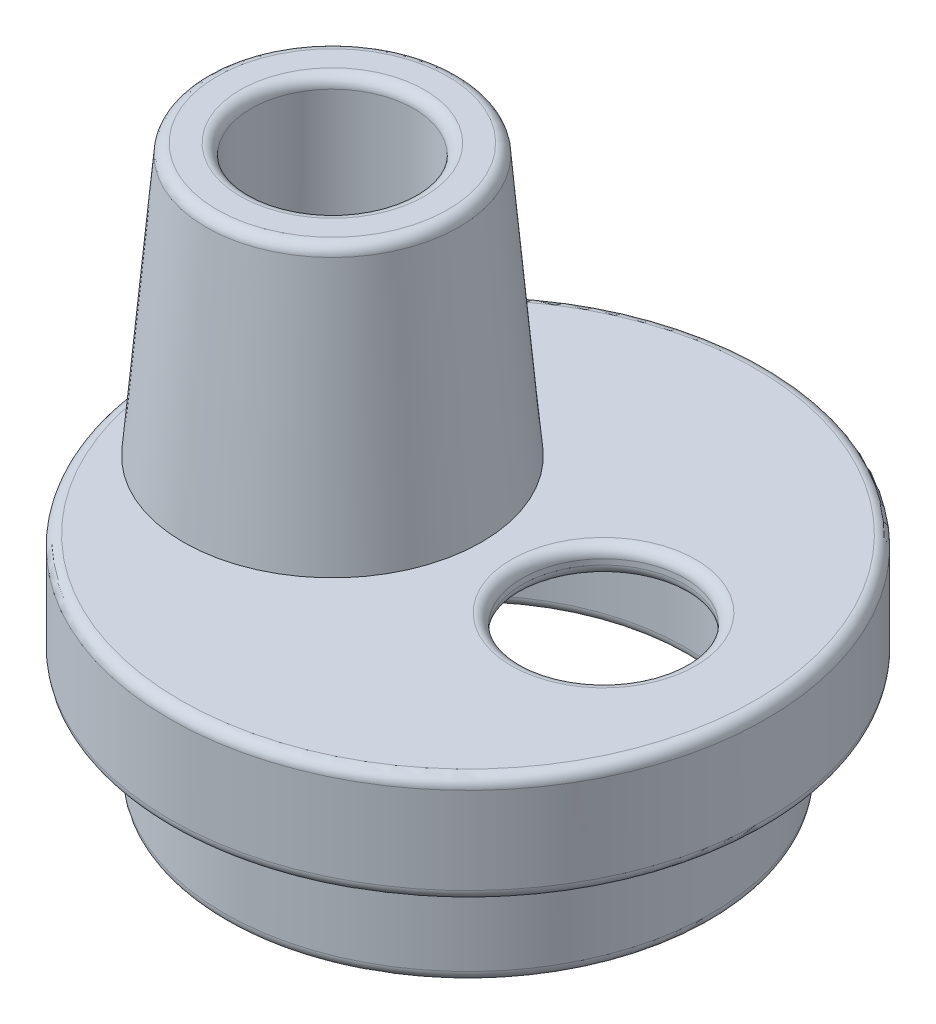
ISO-10303-21;
HEADER;
FILE_DESCRIPTION(('STEP AP214'),'2;1');
FILE_NAME('part.step','',(''),(''),'','','');
FILE_SCHEMA(('AUTOMOTIVE_DESIGN { 1 0 10303 214 1 1 1 1 }'));
ENDSEC;
DATA;
#1=APPLICATION_CONTEXT('core data for automotive mechanical design processes');
#2=APPLICATION_PROTOCOL_DEFINITION('international standard','automotive_design',2000,#1);
#3=PRODUCT_CONTEXT('',#1,'mechanical');
#4=PRODUCT('Part','Part','',(#3));
#5=PRODUCT_RELATED_PRODUCT_CATEGORY('part','',(#4));
#6=PRODUCT_DEFINITION_FORMATION('','',#4);
#7=PRODUCT_DEFINITION_CONTEXT('part definition',#1,'design');
#8=PRODUCT_DEFINITION('design','',#6,#7);
#9=PRODUCT_DEFINITION_SHAPE('','',#8);
#10=(LENGTH_UNIT() NAMED_UNIT(*) SI_UNIT(.MILLI.,.METRE.));
#11=(NAMED_UNIT(*) PLANE_ANGLE_UNIT() SI_UNIT($,.RADIAN.));
#12=(NAMED_UNIT(*) SI_UNIT($,.STERADIAN.) SOLID_ANGLE_UNIT());
#13=UNCERTAINTY_MEASURE_WITH_UNIT(LENGTH_MEASURE(1.E-05),#10,'distance_accuracy_value','');
#14=(GEOMETRIC_REPRESENTATION_CONTEXT(3) GLOBAL_UNCERTAINTY_ASSIGNED_CONTEXT((#13)) GLOBAL_UNIT_ASSIGNED_CONTEXT((#10,
#11,#12)) REPRESENTATION_CONTEXT('',''));
#15=CARTESIAN_POINT('',(0.,0.,0.));
#16=DIRECTION('',(0.,0.,1.));
#17=DIRECTION('',(1.,0.,0.));
#18=AXIS2_PLACEMENT_3D('',#15,#16,#17);
#19=CARTESIAN_POINT('',(0.,0.,0.));
#20=DIRECTION('',(0.,1.,0.));
#21=DIRECTION('',(0.,0.,1.));
#22=AXIS2_PLACEMENT_3D('',#19,#20,#21);
#23=PLANE('',#22);
#24=CARTESIAN_POINT('',(2.5,0.,0.));
#25=DIRECTION('',(0.,1.,0.));
#26=DIRECTION('',(0.,0.,1.));
#27=AXIS2_PLACEMENT_3D('',#24,#25,#26);
#28=CIRCLE('',#27,1.7);
#29=CARTESIAN_POINT('',(2.5,0.,1.7));
#30=VERTEX_POINT('',#29);
#31=EDGE_CURVE('E50',#30,#30,#28,.F.);
#32=ORIENTED_EDGE('',*,*,#31,.T.);
#33=EDGE_LOOP('',(#32));
#34=FACE_BOUND('',#33,.T.);
#35=CARTESIAN_POINT('',(0.,0.,0.));
#36=DIRECTION('',(0.,1.,0.));
#37=DIRECTION('',(0.,0.,1.));
#38=AXIS2_PLACEMENT_3D('',#35,#36,#37);
#39=CIRCLE('',#38,5.3);
#40=CARTESIAN_POINT('',(0.,0.,5.3));
#41=VERTEX_POINT('',#40);
#42=EDGE_CURVE('E55',#41,#41,#39,.T.);
#43=ORIENTED_EDGE('',*,*,#42,.T.);
#44=EDGE_LOOP('',(#43));
#45=FACE_BOUND('',#44,.T.);
#46=CARTESIAN_POINT('',(-2.5,0.,0.));
#47=DIRECTION('',(0.,1.,0.));
#48=DIRECTION('',(0.,0.,1.));
#49=AXIS2_PLACEMENT_3D('',#46,#47,#48);
#50=CIRCLE('',#49,2.75);
#51=CARTESIAN_POINT('',(-2.5,0.,2.75));
#52=VERTEX_POINT('',#51);
#53=EDGE_CURVE('E109',#52,#52,#50,.T.);
#54=ORIENTED_EDGE('',*,*,#53,.F.);
#55=EDGE_LOOP('',(#54));
#56=FACE_BOUND('',#55,.T.);
#57=ADVANCED_FACE('F35',(#34,#45,#56),#23,.T.);
#58=CARTESIAN_POINT('',(0.,0.,0.));
#59=DIRECTION('',(0.,1.,0.));
#60=DIRECTION('',(0.,0.,1.));
#61=AXIS2_PLACEMENT_3D('',#58,#59,#60);
#62=CYLINDRICAL_SURFACE('',#61,5.5);
#63=CARTESIAN_POINT('',(0.,-1.8,0.));
#64=DIRECTION('',(0.,-1.,0.));
#65=DIRECTION('',(0.,0.,-1.));
#66=AXIS2_PLACEMENT_3D('',#63,#64,#65);
#67=CIRCLE('',#66,5.5);
#68=CARTESIAN_POINT('',(0.,-1.8,-5.5));
#69=VERTEX_POINT('',#68);
#70=EDGE_CURVE('E67',#69,#69,#67,.F.);
#71=ORIENTED_EDGE('',*,*,#70,.T.);
#72=EDGE_LOOP('',(#71));
#73=FACE_BOUND('',#72,.T.);
#74=CARTESIAN_POINT('',(0.,-0.2,0.));
#75=DIRECTION('',(0.,1.,0.));
#76=DIRECTION('',(0.,0.,1.));
#77=AXIS2_PLACEMENT_3D('',#74,#75,#76);
#78=CIRCLE('',#77,5.5);
#79=CARTESIAN_POINT('',(0.,-0.200000000000001,5.5));
#80=VERTEX_POINT('',#79);
#81=EDGE_CURVE('E70',#80,#80,#78,.F.);
#82=ORIENTED_EDGE('',*,*,#81,.T.);
#83=EDGE_LOOP('',(#82));
#84=FACE_BOUND('',#83,.T.);
#85=ADVANCED_FACE('F116',(#73,#84),#62,.T.);
#86=CARTESIAN_POINT('',(0.,-2.,5.5));
#87=DIRECTION('',(0.,-1.,0.));
#88=DIRECTION('',(0.,0.,-1.));
#89=AXIS2_PLACEMENT_3D('',#86,#87,#88);
#90=PLANE('',#89);
#91=CARTESIAN_POINT('',(0.,-2.,0.));
#92=DIRECTION('',(0.,-1.,0.));
#93=DIRECTION('',(0.,0.,-1.));
#94=AXIS2_PLACEMENT_3D('',#91,#92,#93);
#95=CIRCLE('',#94,5.3);
#96=CARTESIAN_POINT('',(0.,-2.,-5.3));
#97=VERTEX_POINT('',#96);
#98=EDGE_CURVE('E64',#97,#97,#95,.T.);
#99=ORIENTED_EDGE('',*,*,#98,.T.);
#100=EDGE_LOOP('',(#99));
#101=FACE_BOUND('',#100,.T.);
#102=CARTESIAN_POINT('',(0.,-2.,0.));
#103=DIRECTION('',(0.,1.,0.));
#104=DIRECTION('',(0.,0.,1.));
#105=AXIS2_PLACEMENT_3D('',#102,#103,#104);
#106=CIRCLE('',#105,4.5);
#107=CARTESIAN_POINT('',(0.,-2.,4.5));
#108=VERTEX_POINT('',#107);
#109=EDGE_CURVE('E97',#108,#108,#106,.T.);
#110=ORIENTED_EDGE('',*,*,#109,.T.);
#111=EDGE_LOOP('',(#110));
#112=FACE_BOUND('',#111,.T.);
#113=ADVANCED_FACE('F122',(#101,#112),#90,.T.);
#114=CARTESIAN_POINT('',(0.,0.,0.));
#115=DIRECTION('',(0.,1.,0.));
#116=DIRECTION('',(0.,0.,1.));
#117=AXIS2_PLACEMENT_3D('',#114,#115,#116);
#118=CYLINDRICAL_SURFACE('',#117,4.5);
#119=CARTESIAN_POINT('',(0.,-3.8,0.));
#120=DIRECTION('',(0.,-1.,0.));
#121=DIRECTION('',(0.,0.,-1.));
#122=AXIS2_PLACEMENT_3D('',#119,#120,#121);
#123=CIRCLE('',#122,4.5);
#124=CARTESIAN_POINT('',(0.,-3.8,-4.5));
#125=VERTEX_POINT('',#124);
#126=EDGE_CURVE('E73',#125,#125,#123,.F.);
#127=ORIENTED_EDGE('',*,*,#126,.T.);
#128=EDGE_LOOP('',(#127));
#129=FACE_BOUND('',#128,.T.);
#130=ORIENTED_EDGE('',*,*,#109,.F.);
#131=EDGE_LOOP('',(#130));
#132=FACE_BOUND('',#131,.T.);
#133=ADVANCED_FACE('F201',(#129,#132),#118,.T.);
#134=CARTESIAN_POINT('',(0.,-4.,4.));
#135=DIRECTION('',(0.,-1.,0.));
#136=DIRECTION('',(0.,0.,-1.));
#137=AXIS2_PLACEMENT_3D('',#134,#135,#136);
#138=PLANE('',#137);
#139=CARTESIAN_POINT('',(0.,-4.,0.));
#140=DIRECTION('',(0.,-1.,0.));
#141=DIRECTION('',(0.,0.,-1.));
#142=AXIS2_PLACEMENT_3D('',#139,#140,#141);
#143=CIRCLE('',#142,4.2);
#144=CARTESIAN_POINT('',(0.,-4.,-4.2));
#145=VERTEX_POINT('',#144);
#146=EDGE_CURVE('E79',#145,#145,#143,.F.);
#147=ORIENTED_EDGE('',*,*,#146,.T.);
#148=EDGE_LOOP('',(#147));
#149=FACE_BOUND('',#148,.T.);
#150=CARTESIAN_POINT('',(0.,-4.,0.));
#151=DIRECTION('',(0.,-1.,0.));
#152=DIRECTION('',(0.,0.,-1.));
#153=AXIS2_PLACEMENT_3D('',#150,#151,#152);
#154=CIRCLE('',#153,4.3);
#155=CARTESIAN_POINT('',(0.,-4.,-4.3));
#156=VERTEX_POINT('',#155);
#157=EDGE_CURVE('E82',#156,#156,#154,.T.);
#158=ORIENTED_EDGE('',*,*,#157,.T.);
#159=EDGE_LOOP('',(#158));
#160=FACE_BOUND('',#159,.T.);
#161=ADVANCED_FACE('F197',(#149,#160),#138,.T.);
#162=CARTESIAN_POINT('',(0.,0.,0.));
#163=DIRECTION('',(0.,1.,0.));
#164=DIRECTION('',(0.,0.,1.));
#165=AXIS2_PLACEMENT_3D('',#162,#163,#164);
#166=CYLINDRICAL_SURFACE('',#165,4.);
#167=CARTESIAN_POINT('',(0.,-3.8,0.));
#168=DIRECTION('',(0.,-1.,0.));
#169=DIRECTION('',(0.,0.,-1.));
#170=AXIS2_PLACEMENT_3D('',#167,#168,#169);
#171=CIRCLE('',#170,4.);
#172=CARTESIAN_POINT('',(0.,-3.8,-4.));
#173=VERTEX_POINT('',#172);
#174=EDGE_CURVE('E76',#173,#173,#171,.T.);
#175=ORIENTED_EDGE('',*,*,#174,.T.);
#176=EDGE_LOOP('',(#175));
#177=FACE_BOUND('',#176,.T.);
#178=CARTESIAN_POINT('',(0.,-1.5,0.));
#179=DIRECTION('',(0.,1.,0.));
#180=DIRECTION('',(0.,0.,1.));
#181=AXIS2_PLACEMENT_3D('',#178,#179,#180);
#182=CIRCLE('',#181,4.);
#183=CARTESIAN_POINT('',(0.,-1.5,4.));
#184=VERTEX_POINT('',#183);
#185=EDGE_CURVE('E100',#184,#184,#182,.T.);
#186=ORIENTED_EDGE('',*,*,#185,.T.);
#187=EDGE_LOOP('',(#186));
#188=FACE_BOUND('',#187,.T.);
#189=ADVANCED_FACE('F193',(#177,#188),#166,.F.);
#190=CARTESIAN_POINT('',(0.,-1.5,5.));
#191=DIRECTION('',(0.,1.,0.));
#192=DIRECTION('',(0.,0.,1.));
#193=AXIS2_PLACEMENT_3D('',#190,#191,#192);
#194=PLANE('',#193);
#195=CARTESIAN_POINT('',(0.,-1.5,0.));
#196=DIRECTION('',(0.,1.,0.));
#197=DIRECTION('',(0.,0.,1.));
#198=AXIS2_PLACEMENT_3D('',#195,#196,#197);
#199=CIRCLE('',#198,5.);
#200=CARTESIAN_POINT('',(0.,-1.5,5.));
#201=VERTEX_POINT('',#200);
#202=EDGE_CURVE('E103',#201,#201,#199,.T.);
#203=ORIENTED_EDGE('',*,*,#202,.T.);
#204=EDGE_LOOP('',(#203));
#205=FACE_BOUND('',#204,.T.);
#206=ORIENTED_EDGE('',*,*,#185,.F.);
#207=EDGE_LOOP('',(#206));
#208=FACE_BOUND('',#207,.T.);
#209=ADVANCED_FACE('F189',(#205,#208),#194,.T.);
#210=CARTESIAN_POINT('',(0.,0.,0.));
#211=DIRECTION('',(0.,1.,0.));
#212=DIRECTION('',(0.,0.,1.));
#213=AXIS2_PLACEMENT_3D('',#210,#211,#212);
#214=CYLINDRICAL_SURFACE('',#213,5.);
#215=CARTESIAN_POINT('',(0.,-0.499999999999999,0.));
#216=DIRECTION('',(0.,1.,0.));
#217=DIRECTION('',(0.,0.,1.));
#218=AXIS2_PLACEMENT_3D('',#215,#216,#217);
#219=CIRCLE('',#218,5.);
#220=CARTESIAN_POINT('',(0.,-0.5,5.));
#221=VERTEX_POINT('',#220);
#222=EDGE_CURVE('E106',#221,#221,#219,.T.);
#223=ORIENTED_EDGE('',*,*,#222,.T.);
#224=EDGE_LOOP('',(#223));
#225=FACE_BOUND('',#224,.T.);
#226=ORIENTED_EDGE('',*,*,#202,.F.);
#227=EDGE_LOOP('',(#226));
#228=FACE_BOUND('',#227,.T.);
#229=ADVANCED_FACE('F185',(#225,#228),#214,.F.);
#230=CARTESIAN_POINT('',(0.,-0.5,0.));
#231=DIRECTION('',(0.,-1.,0.));
#232=DIRECTION('',(0.,0.,-1.));
#233=AXIS2_PLACEMENT_3D('',#230,#231,#232);
#234=PLANE('',#233);
#235=CARTESIAN_POINT('',(-2.5,-0.5,0.));
#236=DIRECTION('',(0.,-1.,0.));
#237=DIRECTION('',(0.,0.,-1.));
#238=AXIS2_PLACEMENT_3D('',#235,#236,#237);
#239=CIRCLE('',#238,1.7);
#240=CARTESIAN_POINT('',(-2.5,-0.499999999999999,-1.7));
#241=VERTEX_POINT('',#240);
#242=EDGE_CURVE('E91',#241,#241,#239,.F.);
#243=ORIENTED_EDGE('',*,*,#242,.T.);
#244=EDGE_LOOP('',(#243));
#245=FACE_BOUND('',#244,.T.);
#246=CARTESIAN_POINT('',(2.5,-0.5,0.));
#247=DIRECTION('',(0.,-1.,0.));
#248=DIRECTION('',(0.,0.,-1.));
#249=AXIS2_PLACEMENT_3D('',#246,#247,#248);
#250=CIRCLE('',#249,1.7);
#251=CARTESIAN_POINT('',(2.5,-0.499999999999999,-1.7));
#252=VERTEX_POINT('',#251);
#253=EDGE_CURVE('E94',#252,#252,#250,.F.);
#254=ORIENTED_EDGE('',*,*,#253,.T.);
#255=EDGE_LOOP('',(#254));
#256=FACE_BOUND('',#255,.T.);
#257=ORIENTED_EDGE('',*,*,#222,.F.);
#258=EDGE_LOOP('',(#257));
#259=FACE_BOUND('',#258,.T.);
#260=ADVANCED_FACE('F179',(#245,#256,#259),#234,.T.);
#261=CARTESIAN_POINT('',(2.5,-4.001,0.));
#262=DIRECTION('',(0.,1.,0.));
#263=DIRECTION('',(0.,0.,1.));
#264=AXIS2_PLACEMENT_3D('',#261,#262,#263);
#265=CYLINDRICAL_SURFACE('',#264,1.5);
#266=CARTESIAN_POINT('',(2.5,-0.299999999999999,0.));
#267=DIRECTION('',(0.,-1.,0.));
#268=DIRECTION('',(0.,0.,-1.));
#269=AXIS2_PLACEMENT_3D('',#266,#267,#268);
#270=CIRCLE('',#269,1.5);
#271=CARTESIAN_POINT('',(2.5,-0.299999999999999,-1.5));
#272=VERTEX_POINT('',#271);
#273=EDGE_CURVE('E58',#272,#272,#270,.T.);
#274=ORIENTED_EDGE('',*,*,#273,.T.);
#275=EDGE_LOOP('',(#274));
#276=FACE_BOUND('',#275,.T.);
#277=CARTESIAN_POINT('',(2.5,-0.200000000000001,0.));
#278=DIRECTION('',(0.,1.,0.));
#279=DIRECTION('',(0.,0.,1.));
#280=AXIS2_PLACEMENT_3D('',#277,#278,#279);
#281=CIRCLE('',#280,1.5);
#282=CARTESIAN_POINT('',(2.5,-0.200000000000001,1.5));
#283=VERTEX_POINT('',#282);
#284=EDGE_CURVE('E61',#283,#283,#281,.T.);
#285=ORIENTED_EDGE('',*,*,#284,.T.);
#286=EDGE_LOOP('',(#285));
#287=FACE_BOUND('',#286,.T.);
#288=ADVANCED_FACE('F171',(#276,#287),#265,.F.);
#289=CARTESIAN_POINT('',(-2.5,-4.001,0.));
#290=DIRECTION('',(0.,1.,0.));
#291=DIRECTION('',(0.,0.,1.));
#292=AXIS2_PLACEMENT_3D('',#289,#290,#291);
#293=CYLINDRICAL_SURFACE('',#292,1.5);
#294=CARTESIAN_POINT('',(-2.5,-0.299999999999999,0.));
#295=DIRECTION('',(0.,-1.,0.));
#296=DIRECTION('',(0.,0.,-1.));
#297=AXIS2_PLACEMENT_3D('',#294,#295,#296);
#298=CIRCLE('',#297,1.5);
#299=CARTESIAN_POINT('',(-2.5,-0.299999999999999,-1.5));
#300=VERTEX_POINT('',#299);
#301=EDGE_CURVE('E85',#300,#300,#298,.T.);
#302=ORIENTED_EDGE('',*,*,#301,.T.);
#303=EDGE_LOOP('',(#302));
#304=FACE_BOUND('',#303,.T.);
#305=CARTESIAN_POINT('',(-2.5,4.8,0.));
#306=DIRECTION('',(0.,1.,0.));
#307=DIRECTION('',(0.,0.,1.));
#308=AXIS2_PLACEMENT_3D('',#305,#306,#307);
#309=CIRCLE('',#308,1.5);
#310=CARTESIAN_POINT('',(-2.5,4.8,1.5));
#311=VERTEX_POINT('',#310);
#312=EDGE_CURVE('E88',#311,#311,#309,.T.);
#313=ORIENTED_EDGE('',*,*,#312,.T.);
#314=EDGE_LOOP('',(#313));
#315=FACE_BOUND('',#314,.T.);
#316=ADVANCED_FACE('F169',(#304,#315),#293,.F.);
#317=CARTESIAN_POINT('',(-2.5,5.,0.));
#318=DIRECTION('',(0.,1.,0.));
#319=DIRECTION('',(0.,0.,1.));
#320=AXIS2_PLACEMENT_3D('',#317,#318,#319);
#321=PLANE('',#320);
#322=CARTESIAN_POINT('',(-2.5,5.,0.));
#323=DIRECTION('',(0.,1.,0.));
#324=DIRECTION('',(0.,0.,1.));
#325=AXIS2_PLACEMENT_3D('',#322,#323,#324);
#326=CIRCLE('',#325,2.12929044756689);
#327=CARTESIAN_POINT('',(-2.5,5.,2.1292904475669));
#328=VERTEX_POINT('',#327);
#329=EDGE_CURVE('E42',#328,#328,#326,.T.);
#330=ORIENTED_EDGE('',*,*,#329,.T.);
#331=EDGE_LOOP('',(#330));
#332=FACE_BOUND('',#331,.T.);
#333=CARTESIAN_POINT('',(-2.5,5.,0.));
#334=DIRECTION('',(0.,1.,0.));
#335=DIRECTION('',(0.,0.,1.));
#336=AXIS2_PLACEMENT_3D('',#333,#334,#335);
#337=CIRCLE('',#336,1.7);
#338=CARTESIAN_POINT('',(-2.5,5.,1.7));
#339=VERTEX_POINT('',#338);
#340=EDGE_CURVE('E46',#339,#339,#337,.F.);
#341=ORIENTED_EDGE('',*,*,#340,.T.);
#342=EDGE_LOOP('',(#341));
#343=FACE_BOUND('',#342,.T.);
#344=ADVANCED_FACE('F131',(#332,#343),#321,.T.);
#345=CARTESIAN_POINT('',(-2.5,0.,0.));
#346=DIRECTION('',(0.,-1.,0.));
#347=DIRECTION('',(0.,0.,1.));
#348=AXIS2_PLACEMENT_3D('',#345,#346,#347);
#349=CONICAL_SURFACE('',#348,2.75,0.0872664625997165);
#350=CARTESIAN_POINT('',(-2.5,4.81743114854953,0.));
#351=DIRECTION('',(0.,-1.,0.));
#352=DIRECTION('',(0.,0.,-1.));
#353=AXIS2_PLACEMENT_3D('',#350,#351,#352);
#354=CIRCLE('',#353,2.32852938718524);
#355=CARTESIAN_POINT('',(-2.5,4.81743114854953,-2.32852938718524));
#356=VERTEX_POINT('',#355);
#357=EDGE_CURVE('E10',#356,#356,#354,.T.);
#358=ORIENTED_EDGE('',*,*,#357,.T.);
#359=EDGE_LOOP('',(#358));
#360=FACE_BOUND('',#359,.T.);
#361=ORIENTED_EDGE('',*,*,#53,.T.);
#362=EDGE_LOOP('',(#361));
#363=FACE_BOUND('',#362,.T.);
#364=ADVANCED_FACE('F113',(#360,#363),#349,.T.);
#365=CARTESIAN_POINT('',(-2.5,-0.3,0.));
#366=DIRECTION('',(0.,-1.,0.));
#367=DIRECTION('',(0.,0.,-1.));
#368=AXIS2_PLACEMENT_3D('',#365,#366,#367);
#369=TOROIDAL_SURFACE('',#368,1.7,0.2);
#370=ORIENTED_EDGE('',*,*,#301,.F.);
#371=EDGE_LOOP('',(#370));
#372=FACE_BOUND('',#371,.T.);
#373=ORIENTED_EDGE('',*,*,#242,.F.);
#374=EDGE_LOOP('',(#373));
#375=FACE_BOUND('',#374,.T.);
#376=ADVANCED_FACE('F130',(#372,#375),#369,.T.);
#377=CARTESIAN_POINT('',(0.,-3.8,0.));
#378=DIRECTION('',(0.,-1.,0.));
#379=DIRECTION('',(0.,0.,-1.));
#380=AXIS2_PLACEMENT_3D('',#377,#378,#379);
#381=TOROIDAL_SURFACE('',#380,4.2,0.2);
#382=ORIENTED_EDGE('',*,*,#174,.F.);
#383=EDGE_LOOP('',(#382));
#384=FACE_BOUND('',#383,.T.);
#385=ORIENTED_EDGE('',*,*,#146,.F.);
#386=EDGE_LOOP('',(#385));
#387=FACE_BOUND('',#386,.T.);
#388=ADVANCED_FACE('F134',(#384,#387),#381,.T.);
#389=CARTESIAN_POINT('',(0.,-3.8,0.));
#390=DIRECTION('',(0.,-1.,0.));
#391=DIRECTION('',(0.,0.,-1.));
#392=AXIS2_PLACEMENT_3D('',#389,#390,#391);
#393=TOROIDAL_SURFACE('',#392,4.3,0.2);
#394=ORIENTED_EDGE('',*,*,#157,.F.);
#395=EDGE_LOOP('',(#394));
#396=FACE_BOUND('',#395,.T.);
#397=ORIENTED_EDGE('',*,*,#126,.F.);
#398=EDGE_LOOP('',(#397));
#399=FACE_BOUND('',#398,.T.);
#400=ADVANCED_FACE('F138',(#396,#399),#393,.T.);
#401=CARTESIAN_POINT('',(0.,-1.8,0.));
#402=DIRECTION('',(0.,-1.,0.));
#403=DIRECTION('',(0.,0.,-1.));
#404=AXIS2_PLACEMENT_3D('',#401,#402,#403);
#405=TOROIDAL_SURFACE('',#404,5.3,0.2);
#406=ORIENTED_EDGE('',*,*,#98,.F.);
#407=EDGE_LOOP('',(#406));
#408=FACE_BOUND('',#407,.T.);
#409=ORIENTED_EDGE('',*,*,#70,.F.);
#410=EDGE_LOOP('',(#409));
#411=FACE_BOUND('',#410,.T.);
#412=ADVANCED_FACE('F142',(#408,#411),#405,.T.);
#413=CARTESIAN_POINT('',(2.5,-0.3,0.));
#414=DIRECTION('',(0.,-1.,0.));
#415=DIRECTION('',(0.,0.,-1.));
#416=AXIS2_PLACEMENT_3D('',#413,#414,#415);
#417=TOROIDAL_SURFACE('',#416,1.7,0.2);
#418=ORIENTED_EDGE('',*,*,#273,.F.);
#419=EDGE_LOOP('',(#418));
#420=FACE_BOUND('',#419,.T.);
#421=ORIENTED_EDGE('',*,*,#253,.F.);
#422=EDGE_LOOP('',(#421));
#423=FACE_BOUND('',#422,.T.);
#424=ADVANCED_FACE('F146',(#420,#423),#417,.T.);
#425=CARTESIAN_POINT('',(2.5,-0.2,0.));
#426=DIRECTION('',(0.,1.,0.));
#427=DIRECTION('',(0.,0.,1.));
#428=AXIS2_PLACEMENT_3D('',#425,#426,#427);
#429=TOROIDAL_SURFACE('',#428,1.7,0.2);
#430=ORIENTED_EDGE('',*,*,#31,.F.);
#431=EDGE_LOOP('',(#430));
#432=FACE_BOUND('',#431,.T.);
#433=ORIENTED_EDGE('',*,*,#284,.F.);
#434=EDGE_LOOP('',(#433));
#435=FACE_BOUND('',#434,.T.);
#436=ADVANCED_FACE('F150',(#432,#435),#429,.T.);
#437=CARTESIAN_POINT('',(-2.5,4.8,0.));
#438=DIRECTION('',(0.,1.,0.));
#439=DIRECTION('',(0.,0.,1.));
#440=AXIS2_PLACEMENT_3D('',#437,#438,#439);
#441=TOROIDAL_SURFACE('',#440,2.12929044756689,0.2);
#442=ORIENTED_EDGE('',*,*,#357,.F.);
#443=EDGE_LOOP('',(#442));
#444=FACE_BOUND('',#443,.T.);
#445=ORIENTED_EDGE('',*,*,#329,.F.);
#446=EDGE_LOOP('',(#445));
#447=FACE_BOUND('',#446,.T.);
#448=ADVANCED_FACE('F154',(#444,#447),#441,.T.);
#449=CARTESIAN_POINT('',(-2.5,4.8,0.));
#450=DIRECTION('',(0.,1.,0.));
#451=DIRECTION('',(0.,0.,1.));
#452=AXIS2_PLACEMENT_3D('',#449,#450,#451);
#453=TOROIDAL_SURFACE('',#452,1.7,0.2);
#454=ORIENTED_EDGE('',*,*,#340,.F.);
#455=EDGE_LOOP('',(#454));
#456=FACE_BOUND('',#455,.T.);
#457=ORIENTED_EDGE('',*,*,#312,.F.);
#458=EDGE_LOOP('',(#457));
#459=FACE_BOUND('',#458,.T.);
#460=ADVANCED_FACE('F157',(#456,#459),#453,.T.);
#461=CARTESIAN_POINT('',(0.,-0.2,0.));
#462=DIRECTION('',(0.,1.,0.));
#463=DIRECTION('',(0.,0.,1.));
#464=AXIS2_PLACEMENT_3D('',#461,#462,#463);
#465=TOROIDAL_SURFACE('',#464,5.3,0.2);
#466=ORIENTED_EDGE('',*,*,#81,.F.);
#467=EDGE_LOOP('',(#466));
#468=FACE_BOUND('',#467,.T.);
#469=ORIENTED_EDGE('',*,*,#42,.F.);
#470=EDGE_LOOP('',(#469));
#471=FACE_BOUND('',#470,.T.);
#472=ADVANCED_FACE('F37',(#468,#471),#465,.T.);
#473=CLOSED_SHELL('',(#57,#85,#113,#133,#161,#189,#209,#229,#260,#288,#316,#344,#364,#376,#388,
#400,#412,#424,#436,#448,#460,#472));
#474=MANIFOLD_SOLID_BREP('B2',#473);
#475=ADVANCED_BREP_SHAPE_REPRESENTATION('',(#18,#474),#14);
#476=SHAPE_DEFINITION_REPRESENTATION(#9,#475);
ENDSEC;
END-ISO-10303-21;
